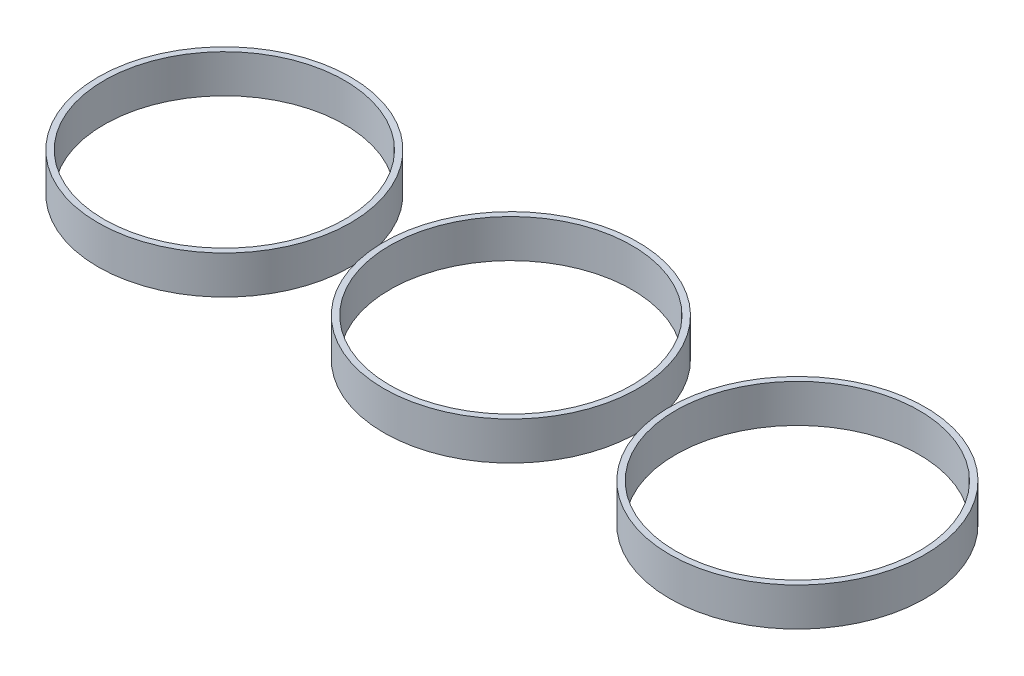
ISO-10303-21;
HEADER;
FILE_DESCRIPTION(('STEP AP214'),'2;1');
FILE_NAME('part.step','',(''),(''),'','','');
FILE_SCHEMA(('AUTOMOTIVE_DESIGN { 1 0 10303 214 1 1 1 1 }'));
ENDSEC;
DATA;
#1=APPLICATION_CONTEXT('core data for automotive mechanical design processes');
#2=APPLICATION_PROTOCOL_DEFINITION('international standard','automotive_design',2000,#1);
#3=PRODUCT_CONTEXT('',#1,'mechanical');
#4=PRODUCT('Part','Part','',(#3));
#5=PRODUCT_RELATED_PRODUCT_CATEGORY('part','',(#4));
#6=PRODUCT_DEFINITION_FORMATION('','',#4);
#7=PRODUCT_DEFINITION_CONTEXT('part definition',#1,'design');
#8=PRODUCT_DEFINITION('design','',#6,#7);
#9=PRODUCT_DEFINITION_SHAPE('','',#8);
#10=(LENGTH_UNIT() NAMED_UNIT(*) SI_UNIT(.MILLI.,.METRE.));
#11=(NAMED_UNIT(*) PLANE_ANGLE_UNIT() SI_UNIT($,.RADIAN.));
#12=(NAMED_UNIT(*) SI_UNIT($,.STERADIAN.) SOLID_ANGLE_UNIT());
#13=UNCERTAINTY_MEASURE_WITH_UNIT(LENGTH_MEASURE(1.E-05),#10,'distance_accuracy_value','');
#14=(GEOMETRIC_REPRESENTATION_CONTEXT(3) GLOBAL_UNCERTAINTY_ASSIGNED_CONTEXT((#13)) GLOBAL_UNIT_ASSIGNED_CONTEXT((#10,
#11,#12)) REPRESENTATION_CONTEXT('',''));
#15=CARTESIAN_POINT('',(0.,0.,0.));
#16=DIRECTION('',(0.,0.,1.));
#17=DIRECTION('',(1.,0.,0.));
#18=AXIS2_PLACEMENT_3D('',#15,#16,#17);
#19=CARTESIAN_POINT('',(120.,8.,0.));
#20=DIRECTION('',(0.,-1.,0.));
#21=DIRECTION('',(0.,0.,-1.));
#22=AXIS2_PLACEMENT_3D('',#19,#20,#21);
#23=CYLINDRICAL_SURFACE('',#22,26.75);
#24=CARTESIAN_POINT('',(120.,8.,0.));
#25=DIRECTION('',(0.,1.,0.));
#26=DIRECTION('',(0.,0.,1.));
#27=AXIS2_PLACEMENT_3D('',#24,#25,#26);
#28=CIRCLE('',#27,26.75);
#29=CARTESIAN_POINT('',(120.,8.,26.75));
#30=VERTEX_POINT('',#29);
#31=EDGE_CURVE('E11',#30,#30,#28,.T.);
#32=ORIENTED_EDGE('',*,*,#31,.F.);
#33=EDGE_LOOP('',(#32));
#34=FACE_BOUND('',#33,.T.);
#35=CARTESIAN_POINT('',(120.,0.,0.));
#36=DIRECTION('',(0.,1.,0.));
#37=DIRECTION('',(0.,0.,1.));
#38=AXIS2_PLACEMENT_3D('',#35,#36,#37);
#39=CIRCLE('',#38,26.75);
#40=CARTESIAN_POINT('',(120.,0.,26.75));
#41=VERTEX_POINT('',#40);
#42=EDGE_CURVE('E43',#41,#41,#39,.T.);
#43=ORIENTED_EDGE('',*,*,#42,.T.);
#44=EDGE_LOOP('',(#43));
#45=FACE_BOUND('',#44,.T.);
#46=ADVANCED_FACE('F40',(#34,#45),#23,.T.);
#47=CARTESIAN_POINT('',(120.,8.,0.));
#48=DIRECTION('',(0.,1.,0.));
#49=DIRECTION('',(0.,0.,1.));
#50=AXIS2_PLACEMENT_3D('',#47,#48,#49);
#51=PLANE('',#50);
#52=CARTESIAN_POINT('',(120.,8.,0.));
#53=DIRECTION('',(0.,1.,0.));
#54=DIRECTION('',(0.,0.,1.));
#55=AXIS2_PLACEMENT_3D('',#52,#53,#54);
#56=CIRCLE('',#55,25.5);
#57=CARTESIAN_POINT('',(120.,8.,25.5));
#58=VERTEX_POINT('',#57);
#59=EDGE_CURVE('E50',#58,#58,#56,.T.);
#60=ORIENTED_EDGE('',*,*,#59,.F.);
#61=EDGE_LOOP('',(#60));
#62=FACE_BOUND('',#61,.T.);
#63=ORIENTED_EDGE('',*,*,#31,.T.);
#64=EDGE_LOOP('',(#63));
#65=FACE_BOUND('',#64,.T.);
#66=ADVANCED_FACE('F68',(#62,#65),#51,.T.);
#67=CARTESIAN_POINT('',(120.,0.,0.));
#68=DIRECTION('',(0.,1.,0.));
#69=DIRECTION('',(0.,0.,1.));
#70=AXIS2_PLACEMENT_3D('',#67,#68,#69);
#71=PLANE('',#70);
#72=CARTESIAN_POINT('',(120.,0.,0.));
#73=DIRECTION('',(0.,1.,0.));
#74=DIRECTION('',(0.,0.,1.));
#75=AXIS2_PLACEMENT_3D('',#72,#73,#74);
#76=CIRCLE('',#75,25.5);
#77=CARTESIAN_POINT('',(120.,0.,25.5));
#78=VERTEX_POINT('',#77);
#79=EDGE_CURVE('E54',#78,#78,#76,.T.);
#80=ORIENTED_EDGE('',*,*,#79,.T.);
#81=EDGE_LOOP('',(#80));
#82=FACE_BOUND('',#81,.T.);
#83=ORIENTED_EDGE('',*,*,#42,.F.);
#84=EDGE_LOOP('',(#83));
#85=FACE_BOUND('',#84,.T.);
#86=ADVANCED_FACE('F58',(#82,#85),#71,.F.);
#87=CARTESIAN_POINT('',(120.,0.,0.));
#88=DIRECTION('',(0.,1.,0.));
#89=DIRECTION('',(0.,0.,1.));
#90=AXIS2_PLACEMENT_3D('',#87,#88,#89);
#91=CYLINDRICAL_SURFACE('',#90,25.5);
#92=ORIENTED_EDGE('',*,*,#59,.T.);
#93=EDGE_LOOP('',(#92));
#94=FACE_BOUND('',#93,.T.);
#95=ORIENTED_EDGE('',*,*,#79,.F.);
#96=EDGE_LOOP('',(#95));
#97=FACE_BOUND('',#96,.T.);
#98=ADVANCED_FACE('F61',(#94,#97),#91,.F.);
#99=CLOSED_SHELL('',(#46,#66,#86,#98));
#100=MANIFOLD_SOLID_BREP('B2',#99);
#101=CARTESIAN_POINT('',(60.,8.,0.));
#102=DIRECTION('',(0.,-1.,0.));
#103=DIRECTION('',(0.,0.,-1.));
#104=AXIS2_PLACEMENT_3D('',#101,#102,#103);
#105=CYLINDRICAL_SURFACE('',#104,26.6);
#106=CARTESIAN_POINT('',(60.,8.,0.));
#107=DIRECTION('',(0.,1.,0.));
#108=DIRECTION('',(0.,0.,1.));
#109=AXIS2_PLACEMENT_3D('',#106,#107,#108);
#110=CIRCLE('',#109,26.6);
#111=CARTESIAN_POINT('',(60.,8.,26.6));
#112=VERTEX_POINT('',#111);
#113=EDGE_CURVE('E39',#112,#112,#110,.T.);
#114=ORIENTED_EDGE('',*,*,#113,.F.);
#115=EDGE_LOOP('',(#114));
#116=FACE_BOUND('',#115,.T.);
#117=CARTESIAN_POINT('',(60.,0.,0.));
#118=DIRECTION('',(0.,1.,0.));
#119=DIRECTION('',(0.,0.,1.));
#120=AXIS2_PLACEMENT_3D('',#117,#118,#119);
#121=CIRCLE('',#120,26.6);
#122=CARTESIAN_POINT('',(60.,0.,26.6));
#123=VERTEX_POINT('',#122);
#124=EDGE_CURVE('E112',#123,#123,#121,.T.);
#125=ORIENTED_EDGE('',*,*,#124,.T.);
#126=EDGE_LOOP('',(#125));
#127=FACE_BOUND('',#126,.T.);
#128=ADVANCED_FACE('F109',(#116,#127),#105,.T.);
#129=CARTESIAN_POINT('',(60.,8.,0.));
#130=DIRECTION('',(0.,1.,0.));
#131=DIRECTION('',(0.,0.,1.));
#132=AXIS2_PLACEMENT_3D('',#129,#130,#131);
#133=PLANE('',#132);
#134=CARTESIAN_POINT('',(60.,8.,0.));
#135=DIRECTION('',(0.,1.,0.));
#136=DIRECTION('',(0.,0.,1.));
#137=AXIS2_PLACEMENT_3D('',#134,#135,#136);
#138=CIRCLE('',#137,25.35);
#139=CARTESIAN_POINT('',(60.,8.,25.35));
#140=VERTEX_POINT('',#139);
#141=EDGE_CURVE('E119',#140,#140,#138,.T.);
#142=ORIENTED_EDGE('',*,*,#141,.F.);
#143=EDGE_LOOP('',(#142));
#144=FACE_BOUND('',#143,.T.);
#145=ORIENTED_EDGE('',*,*,#113,.T.);
#146=EDGE_LOOP('',(#145));
#147=FACE_BOUND('',#146,.T.);
#148=ADVANCED_FACE('F137',(#144,#147),#133,.T.);
#149=CARTESIAN_POINT('',(60.,0.,0.));
#150=DIRECTION('',(0.,1.,0.));
#151=DIRECTION('',(0.,0.,1.));
#152=AXIS2_PLACEMENT_3D('',#149,#150,#151);
#153=PLANE('',#152);
#154=CARTESIAN_POINT('',(60.,0.,0.));
#155=DIRECTION('',(0.,1.,0.));
#156=DIRECTION('',(0.,0.,1.));
#157=AXIS2_PLACEMENT_3D('',#154,#155,#156);
#158=CIRCLE('',#157,25.35);
#159=CARTESIAN_POINT('',(60.,0.,25.35));
#160=VERTEX_POINT('',#159);
#161=EDGE_CURVE('E123',#160,#160,#158,.T.);
#162=ORIENTED_EDGE('',*,*,#161,.T.);
#163=EDGE_LOOP('',(#162));
#164=FACE_BOUND('',#163,.T.);
#165=ORIENTED_EDGE('',*,*,#124,.F.);
#166=EDGE_LOOP('',(#165));
#167=FACE_BOUND('',#166,.T.);
#168=ADVANCED_FACE('F127',(#164,#167),#153,.F.);
#169=CARTESIAN_POINT('',(60.,0.,0.));
#170=DIRECTION('',(0.,1.,0.));
#171=DIRECTION('',(0.,0.,1.));
#172=AXIS2_PLACEMENT_3D('',#169,#170,#171);
#173=CYLINDRICAL_SURFACE('',#172,25.35);
#174=ORIENTED_EDGE('',*,*,#141,.T.);
#175=EDGE_LOOP('',(#174));
#176=FACE_BOUND('',#175,.T.);
#177=ORIENTED_EDGE('',*,*,#161,.F.);
#178=EDGE_LOOP('',(#177));
#179=FACE_BOUND('',#178,.T.);
#180=ADVANCED_FACE('F130',(#176,#179),#173,.F.);
#181=CLOSED_SHELL('',(#128,#148,#168,#180));
#182=MANIFOLD_SOLID_BREP('B6',#181);
#183=CARTESIAN_POINT('',(0.,8.,0.));
#184=DIRECTION('',(0.,-1.,0.));
#185=DIRECTION('',(0.,0.,-1.));
#186=AXIS2_PLACEMENT_3D('',#183,#184,#185);
#187=CYLINDRICAL_SURFACE('',#186,26.45);
#188=CARTESIAN_POINT('',(0.,8.,0.));
#189=DIRECTION('',(0.,1.,0.));
#190=DIRECTION('',(0.,0.,1.));
#191=AXIS2_PLACEMENT_3D('',#188,#189,#190);
#192=CIRCLE('',#191,26.45);
#193=CARTESIAN_POINT('',(0.,8.,26.45));
#194=VERTEX_POINT('',#193);
#195=EDGE_CURVE('E108',#194,#194,#192,.T.);
#196=ORIENTED_EDGE('',*,*,#195,.F.);
#197=EDGE_LOOP('',(#196));
#198=FACE_BOUND('',#197,.T.);
#199=CARTESIAN_POINT('',(0.,0.,0.));
#200=DIRECTION('',(0.,1.,0.));
#201=DIRECTION('',(0.,0.,1.));
#202=AXIS2_PLACEMENT_3D('',#199,#200,#201);
#203=CIRCLE('',#202,26.45);
#204=CARTESIAN_POINT('',(0.,0.,26.45));
#205=VERTEX_POINT('',#204);
#206=EDGE_CURVE('E173',#205,#205,#203,.T.);
#207=ORIENTED_EDGE('',*,*,#206,.T.);
#208=EDGE_LOOP('',(#207));
#209=FACE_BOUND('',#208,.T.);
#210=ADVANCED_FACE('F170',(#198,#209),#187,.T.);
#211=CARTESIAN_POINT('',(0.,8.,0.));
#212=DIRECTION('',(0.,1.,0.));
#213=DIRECTION('',(0.,0.,1.));
#214=AXIS2_PLACEMENT_3D('',#211,#212,#213);
#215=PLANE('',#214);
#216=CARTESIAN_POINT('',(0.,8.,0.));
#217=DIRECTION('',(0.,1.,0.));
#218=DIRECTION('',(0.,0.,1.));
#219=AXIS2_PLACEMENT_3D('',#216,#217,#218);
#220=CIRCLE('',#219,25.2);
#221=CARTESIAN_POINT('',(0.,8.,25.2));
#222=VERTEX_POINT('',#221);
#223=EDGE_CURVE('E180',#222,#222,#220,.T.);
#224=ORIENTED_EDGE('',*,*,#223,.F.);
#225=EDGE_LOOP('',(#224));
#226=FACE_BOUND('',#225,.T.);
#227=ORIENTED_EDGE('',*,*,#195,.T.);
#228=EDGE_LOOP('',(#227));
#229=FACE_BOUND('',#228,.T.);
#230=ADVANCED_FACE('F198',(#226,#229),#215,.T.);
#231=CARTESIAN_POINT('',(0.,0.,0.));
#232=DIRECTION('',(0.,1.,0.));
#233=DIRECTION('',(0.,0.,1.));
#234=AXIS2_PLACEMENT_3D('',#231,#232,#233);
#235=PLANE('',#234);
#236=CARTESIAN_POINT('',(0.,0.,0.));
#237=DIRECTION('',(0.,1.,0.));
#238=DIRECTION('',(0.,0.,1.));
#239=AXIS2_PLACEMENT_3D('',#236,#237,#238);
#240=CIRCLE('',#239,25.2);
#241=CARTESIAN_POINT('',(0.,0.,25.2));
#242=VERTEX_POINT('',#241);
#243=EDGE_CURVE('E184',#242,#242,#240,.T.);
#244=ORIENTED_EDGE('',*,*,#243,.T.);
#245=EDGE_LOOP('',(#244));
#246=FACE_BOUND('',#245,.T.);
#247=ORIENTED_EDGE('',*,*,#206,.F.);
#248=EDGE_LOOP('',(#247));
#249=FACE_BOUND('',#248,.T.);
#250=ADVANCED_FACE('F188',(#246,#249),#235,.F.);
#251=CARTESIAN_POINT('',(0.,0.,0.));
#252=DIRECTION('',(0.,1.,0.));
#253=DIRECTION('',(0.,0.,1.));
#254=AXIS2_PLACEMENT_3D('',#251,#252,#253);
#255=CYLINDRICAL_SURFACE('',#254,25.2);
#256=ORIENTED_EDGE('',*,*,#223,.T.);
#257=EDGE_LOOP('',(#256));
#258=FACE_BOUND('',#257,.T.);
#259=ORIENTED_EDGE('',*,*,#243,.F.);
#260=EDGE_LOOP('',(#259));
#261=FACE_BOUND('',#260,.T.);
#262=ADVANCED_FACE('F191',(#258,#261),#255,.F.);
#263=CLOSED_SHELL('',(#210,#230,#250,#262));
#264=MANIFOLD_SOLID_BREP('B34',#263);
#265=ADVANCED_BREP_SHAPE_REPRESENTATION('',(#18,#100,#182,#264),#14);
#266=SHAPE_DEFINITION_REPRESENTATION(#9,#265);
ENDSEC;
END-ISO-10303-21;
